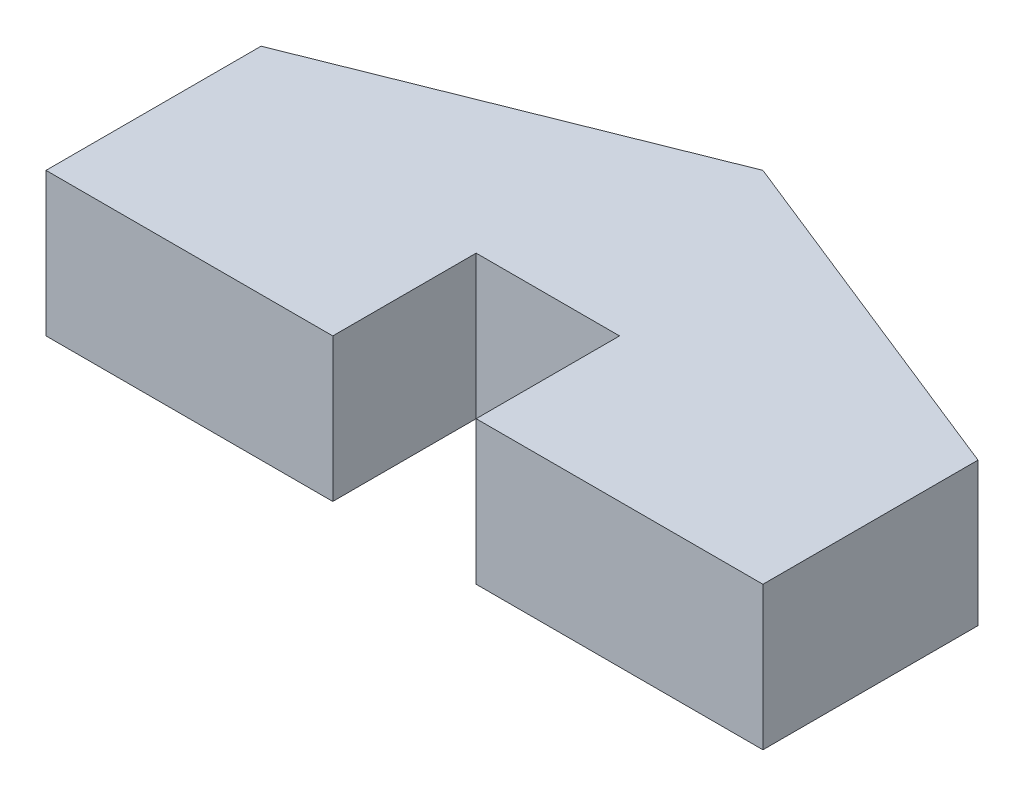
ISO-10303-21;
HEADER;
FILE_DESCRIPTION(('STEP AP214'),'2;1');
FILE_NAME('part.step','',(''),(''),'','','');
FILE_SCHEMA(('AUTOMOTIVE_DESIGN { 1 0 10303 214 1 1 1 1 }'));
ENDSEC;
DATA;
#1=APPLICATION_CONTEXT('core data for automotive mechanical design processes');
#2=APPLICATION_PROTOCOL_DEFINITION('international standard','automotive_design',2000,#1);
#3=PRODUCT_CONTEXT('',#1,'mechanical');
#4=PRODUCT('Part','Part','',(#3));
#5=PRODUCT_RELATED_PRODUCT_CATEGORY('part','',(#4));
#6=PRODUCT_DEFINITION_FORMATION('','',#4);
#7=PRODUCT_DEFINITION_CONTEXT('part definition',#1,'design');
#8=PRODUCT_DEFINITION('design','',#6,#7);
#9=PRODUCT_DEFINITION_SHAPE('','',#8);
#10=(LENGTH_UNIT() NAMED_UNIT(*) SI_UNIT(.MILLI.,.METRE.));
#11=(NAMED_UNIT(*) PLANE_ANGLE_UNIT() SI_UNIT($,.RADIAN.));
#12=(NAMED_UNIT(*) SI_UNIT($,.STERADIAN.) SOLID_ANGLE_UNIT());
#13=UNCERTAINTY_MEASURE_WITH_UNIT(LENGTH_MEASURE(1.E-05),#10,'distance_accuracy_value','');
#14=(GEOMETRIC_REPRESENTATION_CONTEXT(3) GLOBAL_UNCERTAINTY_ASSIGNED_CONTEXT((#13)) GLOBAL_UNIT_ASSIGNED_CONTEXT((#10,
#11,#12)) REPRESENTATION_CONTEXT('',''));
#15=CARTESIAN_POINT('',(0.,0.,0.));
#16=DIRECTION('',(0.,0.,1.));
#17=DIRECTION('',(1.,0.,0.));
#18=AXIS2_PLACEMENT_3D('',#15,#16,#17);
#19=CARTESIAN_POINT('',(0.,20.,0.));
#20=DIRECTION('',(1.,0.,0.));
#21=DIRECTION('',(0.,0.,-1.));
#22=AXIS2_PLACEMENT_3D('',#19,#20,#21);
#23=PLANE('',#22);
#24=DIRECTION('',(0.,0.,1.));
#25=VECTOR('',#24,1.);
#26=CARTESIAN_POINT('',(0.,0.,0.));
#27=LINE('',#26,#25);
#28=CARTESIAN_POINT('',(0.,0.,-30.));
#29=VERTEX_POINT('',#28);
#30=CARTESIAN_POINT('',(0.,0.,0.));
#31=VERTEX_POINT('',#30);
#32=EDGE_CURVE('E135',#29,#31,#27,.T.);
#33=ORIENTED_EDGE('',*,*,#32,.T.);
#34=DIRECTION('',(0.,-1.,0.));
#35=VECTOR('',#34,1.);
#36=CARTESIAN_POINT('',(0.,20.,0.));
#37=LINE('',#36,#35);
#38=CARTESIAN_POINT('',(0.,20.,0.));
#39=VERTEX_POINT('',#38);
#40=EDGE_CURVE('E11',#39,#31,#37,.T.);
#41=ORIENTED_EDGE('',*,*,#40,.F.);
#42=DIRECTION('',(0.,0.,1.));
#43=VECTOR('',#42,1.);
#44=CARTESIAN_POINT('',(0.,20.,0.));
#45=LINE('',#44,#43);
#46=CARTESIAN_POINT('',(0.,20.,-30.));
#47=VERTEX_POINT('',#46);
#48=EDGE_CURVE('E151',#47,#39,#45,.T.);
#49=ORIENTED_EDGE('',*,*,#48,.F.);
#50=DIRECTION('',(0.,-1.,0.));
#51=VECTOR('',#50,1.);
#52=CARTESIAN_POINT('',(0.,20.,-30.));
#53=LINE('',#52,#51);
#54=EDGE_CURVE('E131',#47,#29,#53,.T.);
#55=ORIENTED_EDGE('',*,*,#54,.T.);
#56=EDGE_LOOP('',(#33,#41,#49,#55));
#57=FACE_BOUND('',#56,.T.);
#58=ADVANCED_FACE('F33',(#57),#23,.F.);
#59=CARTESIAN_POINT('',(0.,20.,0.));
#60=DIRECTION('',(0.,0.,-1.));
#61=DIRECTION('',(-1.,0.,0.));
#62=AXIS2_PLACEMENT_3D('',#59,#60,#61);
#63=PLANE('',#62);
#64=DIRECTION('',(1.,0.,0.));
#65=VECTOR('',#64,1.);
#66=CARTESIAN_POINT('',(0.,0.,0.));
#67=LINE('',#66,#65);
#68=CARTESIAN_POINT('',(40.,0.,0.));
#69=VERTEX_POINT('',#68);
#70=EDGE_CURVE('E138',#31,#69,#67,.T.);
#71=ORIENTED_EDGE('',*,*,#70,.T.);
#72=DIRECTION('',(0.,-1.,0.));
#73=VECTOR('',#72,1.);
#74=CARTESIAN_POINT('',(40.,20.,0.));
#75=LINE('',#74,#73);
#76=CARTESIAN_POINT('',(40.,20.,0.));
#77=VERTEX_POINT('',#76);
#78=EDGE_CURVE('E41',#77,#69,#75,.T.);
#79=ORIENTED_EDGE('',*,*,#78,.F.);
#80=DIRECTION('',(1.,0.,0.));
#81=VECTOR('',#80,1.);
#82=CARTESIAN_POINT('',(0.,20.,0.));
#83=LINE('',#82,#81);
#84=EDGE_CURVE('E95',#39,#77,#83,.T.);
#85=ORIENTED_EDGE('',*,*,#84,.F.);
#86=ORIENTED_EDGE('',*,*,#40,.T.);
#87=EDGE_LOOP('',(#71,#79,#85,#86));
#88=FACE_BOUND('',#87,.T.);
#89=ADVANCED_FACE('F194',(#88),#63,.F.);
#90=CARTESIAN_POINT('',(40.,20.,0.));
#91=DIRECTION('',(-1.,0.,0.));
#92=DIRECTION('',(0.,0.,1.));
#93=AXIS2_PLACEMENT_3D('',#90,#91,#92);
#94=PLANE('',#93);
#95=DIRECTION('',(0.,0.,-1.));
#96=VECTOR('',#95,1.);
#97=CARTESIAN_POINT('',(40.,0.,0.));
#98=LINE('',#97,#96);
#99=CARTESIAN_POINT('',(40.,0.,-20.));
#100=VERTEX_POINT('',#99);
#101=EDGE_CURVE('E140',#69,#100,#98,.T.);
#102=ORIENTED_EDGE('',*,*,#101,.T.);
#103=DIRECTION('',(0.,-1.,0.));
#104=VECTOR('',#103,1.);
#105=CARTESIAN_POINT('',(40.,20.,-20.));
#106=LINE('',#105,#104);
#107=CARTESIAN_POINT('',(40.,20.,-20.));
#108=VERTEX_POINT('',#107);
#109=EDGE_CURVE('E161',#108,#100,#106,.T.);
#110=ORIENTED_EDGE('',*,*,#109,.F.);
#111=DIRECTION('',(0.,0.,-1.));
#112=VECTOR('',#111,1.);
#113=CARTESIAN_POINT('',(40.,20.,0.));
#114=LINE('',#113,#112);
#115=EDGE_CURVE('E169',#77,#108,#114,.T.);
#116=ORIENTED_EDGE('',*,*,#115,.F.);
#117=ORIENTED_EDGE('',*,*,#78,.T.);
#118=EDGE_LOOP('',(#102,#110,#116,#117));
#119=FACE_BOUND('',#118,.T.);
#120=ADVANCED_FACE('F167',(#119),#94,.F.);
#121=CARTESIAN_POINT('',(60.,20.,-20.));
#122=DIRECTION('',(0.,0.,-1.));
#123=DIRECTION('',(-1.,0.,0.));
#124=AXIS2_PLACEMENT_3D('',#121,#122,#123);
#125=PLANE('',#124);
#126=DIRECTION('',(1.,0.,0.));
#127=VECTOR('',#126,1.);
#128=CARTESIAN_POINT('',(60.,0.,-20.));
#129=LINE('',#128,#127);
#130=CARTESIAN_POINT('',(60.,0.,-20.));
#131=VERTEX_POINT('',#130);
#132=EDGE_CURVE('E142',#100,#131,#129,.T.);
#133=ORIENTED_EDGE('',*,*,#132,.T.);
#134=DIRECTION('',(0.,-1.,0.));
#135=VECTOR('',#134,1.);
#136=CARTESIAN_POINT('',(60.,20.,-20.));
#137=LINE('',#136,#135);
#138=CARTESIAN_POINT('',(60.,20.,-20.));
#139=VERTEX_POINT('',#138);
#140=EDGE_CURVE('E158',#139,#131,#137,.T.);
#141=ORIENTED_EDGE('',*,*,#140,.F.);
#142=DIRECTION('',(1.,0.,0.));
#143=VECTOR('',#142,1.);
#144=CARTESIAN_POINT('',(60.,20.,-20.));
#145=LINE('',#144,#143);
#146=EDGE_CURVE('E185',#108,#139,#145,.T.);
#147=ORIENTED_EDGE('',*,*,#146,.F.);
#148=ORIENTED_EDGE('',*,*,#109,.T.);
#149=EDGE_LOOP('',(#133,#141,#147,#148));
#150=FACE_BOUND('',#149,.T.);
#151=ADVANCED_FACE('F178',(#150),#125,.F.);
#152=CARTESIAN_POINT('',(60.,20.,0.));
#153=DIRECTION('',(1.,0.,0.));
#154=DIRECTION('',(0.,0.,-1.));
#155=AXIS2_PLACEMENT_3D('',#152,#153,#154);
#156=PLANE('',#155);
#157=DIRECTION('',(0.,0.,1.));
#158=VECTOR('',#157,1.);
#159=CARTESIAN_POINT('',(60.,0.,0.));
#160=LINE('',#159,#158);
#161=CARTESIAN_POINT('',(60.,0.,0.));
#162=VERTEX_POINT('',#161);
#163=EDGE_CURVE('E144',#131,#162,#160,.T.);
#164=ORIENTED_EDGE('',*,*,#163,.T.);
#165=DIRECTION('',(0.,-1.,0.));
#166=VECTOR('',#165,1.);
#167=CARTESIAN_POINT('',(60.,20.,0.));
#168=LINE('',#167,#166);
#169=CARTESIAN_POINT('',(60.,20.,0.));
#170=VERTEX_POINT('',#169);
#171=EDGE_CURVE('E155',#170,#162,#168,.T.);
#172=ORIENTED_EDGE('',*,*,#171,.F.);
#173=DIRECTION('',(0.,0.,1.));
#174=VECTOR('',#173,1.);
#175=CARTESIAN_POINT('',(60.,20.,0.));
#176=LINE('',#175,#174);
#177=EDGE_CURVE('E184',#139,#170,#176,.T.);
#178=ORIENTED_EDGE('',*,*,#177,.F.);
#179=ORIENTED_EDGE('',*,*,#140,.T.);
#180=EDGE_LOOP('',(#164,#172,#178,#179));
#181=FACE_BOUND('',#180,.T.);
#182=ADVANCED_FACE('F182',(#181),#156,.F.);
#183=CARTESIAN_POINT('',(60.,20.,0.));
#184=DIRECTION('',(0.,0.,-1.));
#185=DIRECTION('',(-1.,0.,0.));
#186=AXIS2_PLACEMENT_3D('',#183,#184,#185);
#187=PLANE('',#186);
#188=DIRECTION('',(1.,0.,0.));
#189=VECTOR('',#188,1.);
#190=CARTESIAN_POINT('',(60.,0.,0.));
#191=LINE('',#190,#189);
#192=CARTESIAN_POINT('',(100.,0.,0.));
#193=VERTEX_POINT('',#192);
#194=EDGE_CURVE('E146',#162,#193,#191,.T.);
#195=ORIENTED_EDGE('',*,*,#194,.T.);
#196=DIRECTION('',(0.,-1.,0.));
#197=VECTOR('',#196,1.);
#198=CARTESIAN_POINT('',(100.,20.,0.));
#199=LINE('',#198,#197);
#200=CARTESIAN_POINT('',(100.,20.,0.));
#201=VERTEX_POINT('',#200);
#202=EDGE_CURVE('E126',#201,#193,#199,.T.);
#203=ORIENTED_EDGE('',*,*,#202,.F.);
#204=DIRECTION('',(1.,0.,0.));
#205=VECTOR('',#204,1.);
#206=CARTESIAN_POINT('',(60.,20.,0.));
#207=LINE('',#206,#205);
#208=EDGE_CURVE('E117',#170,#201,#207,.T.);
#209=ORIENTED_EDGE('',*,*,#208,.F.);
#210=ORIENTED_EDGE('',*,*,#171,.T.);
#211=EDGE_LOOP('',(#195,#203,#209,#210));
#212=FACE_BOUND('',#211,.T.);
#213=ADVANCED_FACE('F206',(#212),#187,.F.);
#214=CARTESIAN_POINT('',(100.,20.,0.));
#215=DIRECTION('',(-1.,0.,0.));
#216=DIRECTION('',(0.,0.,1.));
#217=AXIS2_PLACEMENT_3D('',#214,#215,#216);
#218=PLANE('',#217);
#219=DIRECTION('',(0.,0.,-1.));
#220=VECTOR('',#219,1.);
#221=CARTESIAN_POINT('',(100.,0.,0.));
#222=LINE('',#221,#220);
#223=CARTESIAN_POINT('',(100.,0.,-30.));
#224=VERTEX_POINT('',#223);
#225=EDGE_CURVE('E125',#193,#224,#222,.T.);
#226=ORIENTED_EDGE('',*,*,#225,.T.);
#227=DIRECTION('',(0.,-1.,0.));
#228=VECTOR('',#227,1.);
#229=CARTESIAN_POINT('',(100.,20.,-30.));
#230=LINE('',#229,#228);
#231=CARTESIAN_POINT('',(100.,20.,-30.));
#232=VERTEX_POINT('',#231);
#233=EDGE_CURVE('E122',#232,#224,#230,.T.);
#234=ORIENTED_EDGE('',*,*,#233,.F.);
#235=DIRECTION('',(0.,0.,-1.));
#236=VECTOR('',#235,1.);
#237=CARTESIAN_POINT('',(100.,20.,0.));
#238=LINE('',#237,#236);
#239=EDGE_CURVE('E111',#201,#232,#238,.T.);
#240=ORIENTED_EDGE('',*,*,#239,.F.);
#241=ORIENTED_EDGE('',*,*,#202,.T.);
#242=EDGE_LOOP('',(#226,#234,#240,#241));
#243=FACE_BOUND('',#242,.T.);
#244=ADVANCED_FACE('F123',(#243),#218,.F.);
#245=CARTESIAN_POINT('',(50.,20.,-50.));
#246=DIRECTION('',(-0.371390676354104,0.,0.928476690885259));
#247=DIRECTION('',(0.928476690885259,0.,0.371390676354104));
#248=AXIS2_PLACEMENT_3D('',#245,#246,#247);
#249=PLANE('',#248);
#250=DIRECTION('',(-0.928476690885259,0.,-0.371390676354104));
#251=VECTOR('',#250,1.);
#252=CARTESIAN_POINT('',(50.,0.,-50.));
#253=LINE('',#252,#251);
#254=CARTESIAN_POINT('',(50.,0.,-50.));
#255=VERTEX_POINT('',#254);
#256=EDGE_CURVE('E81',#224,#255,#253,.T.);
#257=ORIENTED_EDGE('',*,*,#256,.T.);
#258=DIRECTION('',(0.,-1.,0.));
#259=VECTOR('',#258,1.);
#260=CARTESIAN_POINT('',(50.,20.,-50.));
#261=LINE('',#260,#259);
#262=CARTESIAN_POINT('',(50.,20.,-50.));
#263=VERTEX_POINT('',#262);
#264=EDGE_CURVE('E127',#263,#255,#261,.T.);
#265=ORIENTED_EDGE('',*,*,#264,.F.);
#266=DIRECTION('',(-0.928476690885259,0.,-0.371390676354104));
#267=VECTOR('',#266,1.);
#268=CARTESIAN_POINT('',(50.,20.,-50.));
#269=LINE('',#268,#267);
#270=EDGE_CURVE('E115',#232,#263,#269,.T.);
#271=ORIENTED_EDGE('',*,*,#270,.F.);
#272=ORIENTED_EDGE('',*,*,#233,.T.);
#273=EDGE_LOOP('',(#257,#265,#271,#272));
#274=FACE_BOUND('',#273,.T.);
#275=ADVANCED_FACE('F129',(#274),#249,.F.);
#276=CARTESIAN_POINT('',(50.,20.,-50.));
#277=DIRECTION('',(0.371390676354104,0.,0.928476690885259));
#278=DIRECTION('',(0.928476690885259,0.,-0.371390676354104));
#279=AXIS2_PLACEMENT_3D('',#276,#277,#278);
#280=PLANE('',#279);
#281=DIRECTION('',(-0.928476690885259,0.,0.371390676354104));
#282=VECTOR('',#281,1.);
#283=CARTESIAN_POINT('',(50.,0.,-50.));
#284=LINE('',#283,#282);
#285=EDGE_CURVE('E87',#255,#29,#284,.T.);
#286=ORIENTED_EDGE('',*,*,#285,.T.);
#287=ORIENTED_EDGE('',*,*,#54,.F.);
#288=DIRECTION('',(-0.928476690885259,0.,0.371390676354104));
#289=VECTOR('',#288,1.);
#290=CARTESIAN_POINT('',(50.,20.,-50.));
#291=LINE('',#290,#289);
#292=EDGE_CURVE('E49',#263,#47,#291,.T.);
#293=ORIENTED_EDGE('',*,*,#292,.F.);
#294=ORIENTED_EDGE('',*,*,#264,.T.);
#295=EDGE_LOOP('',(#286,#287,#293,#294));
#296=FACE_BOUND('',#295,.T.);
#297=ADVANCED_FACE('F214',(#296),#280,.F.);
#298=CARTESIAN_POINT('',(0.,20.,0.));
#299=DIRECTION('',(0.,-1.,0.));
#300=DIRECTION('',(0.,0.,-1.));
#301=AXIS2_PLACEMENT_3D('',#298,#299,#300);
#302=PLANE('',#301);
#303=ORIENTED_EDGE('',*,*,#48,.T.);
#304=ORIENTED_EDGE('',*,*,#84,.T.);
#305=ORIENTED_EDGE('',*,*,#115,.T.);
#306=ORIENTED_EDGE('',*,*,#146,.T.);
#307=ORIENTED_EDGE('',*,*,#177,.T.);
#308=ORIENTED_EDGE('',*,*,#208,.T.);
#309=ORIENTED_EDGE('',*,*,#239,.T.);
#310=ORIENTED_EDGE('',*,*,#270,.T.);
#311=ORIENTED_EDGE('',*,*,#292,.T.);
#312=EDGE_LOOP('',(#303,#304,#305,#306,#307,#308,#309,#310,#311));
#313=FACE_BOUND('',#312,.T.);
#314=ADVANCED_FACE('F113',(#313),#302,.F.);
#315=CARTESIAN_POINT('',(0.,0.,0.));
#316=DIRECTION('',(0.,-1.,0.));
#317=DIRECTION('',(0.,0.,-1.));
#318=AXIS2_PLACEMENT_3D('',#315,#316,#317);
#319=PLANE('',#318);
#320=ORIENTED_EDGE('',*,*,#32,.F.);
#321=ORIENTED_EDGE('',*,*,#285,.F.);
#322=ORIENTED_EDGE('',*,*,#256,.F.);
#323=ORIENTED_EDGE('',*,*,#225,.F.);
#324=ORIENTED_EDGE('',*,*,#194,.F.);
#325=ORIENTED_EDGE('',*,*,#163,.F.);
#326=ORIENTED_EDGE('',*,*,#132,.F.);
#327=ORIENTED_EDGE('',*,*,#101,.F.);
#328=ORIENTED_EDGE('',*,*,#70,.F.);
#329=EDGE_LOOP('',(#320,#321,#322,#323,#324,#325,#326,#327,#328));
#330=FACE_BOUND('',#329,.T.);
#331=ADVANCED_FACE('F173',(#330),#319,.T.);
#332=CLOSED_SHELL('',(#58,#89,#120,#151,#182,#213,#244,#275,#297,#314,#331));
#333=MANIFOLD_SOLID_BREP('B2',#332);
#334=ADVANCED_BREP_SHAPE_REPRESENTATION('',(#18,#333),#14);
#335=SHAPE_DEFINITION_REPRESENTATION(#9,#334);
ENDSEC;
END-ISO-10303-21;
